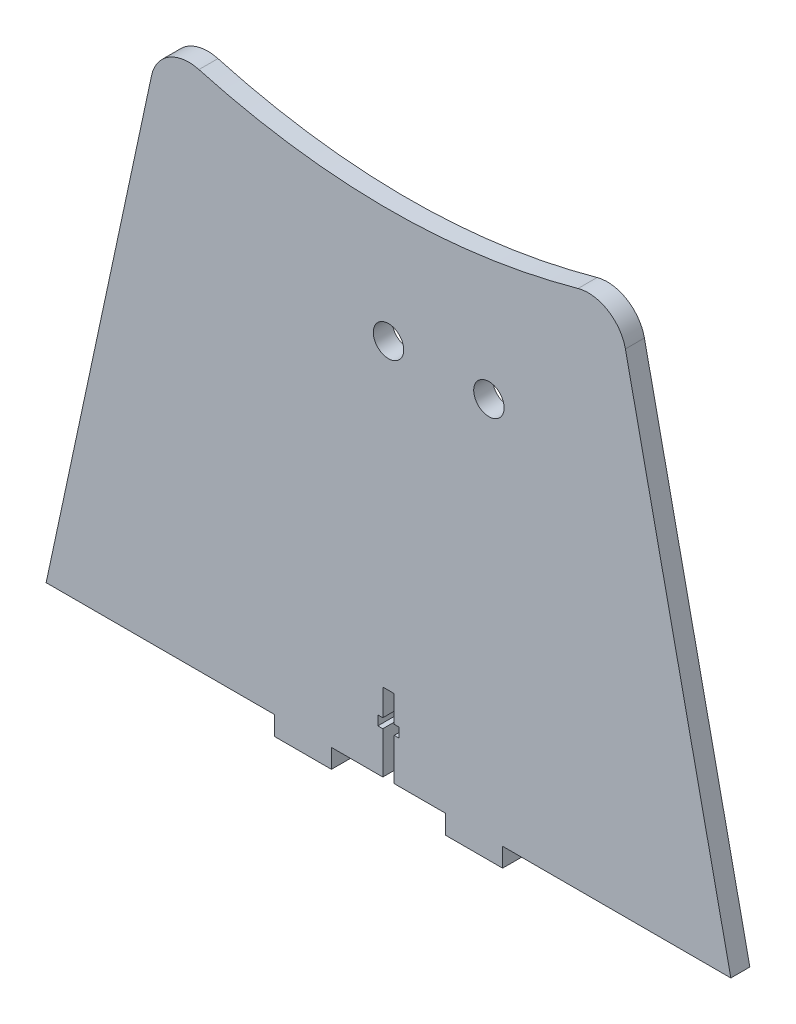
ISO-10303-21;
HEADER;
FILE_DESCRIPTION(('STEP AP214'),'2;1');
FILE_NAME('part.step','',(''),(''),'','','');
FILE_SCHEMA(('AUTOMOTIVE_DESIGN { 1 0 10303 214 1 1 1 1 }'));
ENDSEC;
DATA;
#1=APPLICATION_CONTEXT('core data for automotive mechanical design processes');
#2=APPLICATION_PROTOCOL_DEFINITION('international standard','automotive_design',2000,#1);
#3=PRODUCT_CONTEXT('',#1,'mechanical');
#4=PRODUCT('Part','Part','',(#3));
#5=PRODUCT_RELATED_PRODUCT_CATEGORY('part','',(#4));
#6=PRODUCT_DEFINITION_FORMATION('','',#4);
#7=PRODUCT_DEFINITION_CONTEXT('part definition',#1,'design');
#8=PRODUCT_DEFINITION('design','',#6,#7);
#9=PRODUCT_DEFINITION_SHAPE('','',#8);
#10=(LENGTH_UNIT() NAMED_UNIT(*) SI_UNIT(.MILLI.,.METRE.));
#11=(NAMED_UNIT(*) PLANE_ANGLE_UNIT() SI_UNIT($,.RADIAN.));
#12=(NAMED_UNIT(*) SI_UNIT($,.STERADIAN.) SOLID_ANGLE_UNIT());
#13=UNCERTAINTY_MEASURE_WITH_UNIT(LENGTH_MEASURE(1.E-05),#10,'distance_accuracy_value','');
#14=(GEOMETRIC_REPRESENTATION_CONTEXT(3) GLOBAL_UNCERTAINTY_ASSIGNED_CONTEXT((#13)) GLOBAL_UNIT_ASSIGNED_CONTEXT((#10,
#11,#12)) REPRESENTATION_CONTEXT('',''));
#15=CARTESIAN_POINT('',(0.,0.,0.));
#16=DIRECTION('',(0.,0.,1.));
#17=DIRECTION('',(1.,0.,0.));
#18=AXIS2_PLACEMENT_3D('',#15,#16,#17);
#19=CARTESIAN_POINT('',(52.545739232614,87.1208248078202,5.));
#20=DIRECTION('',(0.,0.,1.));
#21=DIRECTION('',(1.,0.,0.));
#22=AXIS2_PLACEMENT_3D('',#19,#20,#21);
#23=PLANE('',#22);
#24=CARTESIAN_POINT('',(26.4429896128564,59.8597265776105,5.));
#25=DIRECTION('',(0.,0.,1.));
#26=DIRECTION('',(1.,0.,0.));
#27=AXIS2_PLACEMENT_3D('',#24,#25,#26);
#28=CIRCLE('',#27,4.);
#29=CARTESIAN_POINT('',(30.4429896128564,59.8597265776105,5.));
#30=VERTEX_POINT('',#29);
#31=EDGE_CURVE('E244',#30,#30,#28,.T.);
#32=ORIENTED_EDGE('',*,*,#31,.F.);
#33=EDGE_LOOP('',(#32));
#34=FACE_BOUND('',#33,.T.);
#35=DIRECTION('',(1.,0.,0.));
#36=VECTOR('',#35,1.);
#37=CARTESIAN_POINT('',(-89.9570103871437,-40.1402734223895,5.));
#38=LINE('',#37,#36);
#39=CARTESIAN_POINT('',(-89.9570103871437,-40.1402734223895,5.));
#40=VERTEX_POINT('',#39);
#41=CARTESIAN_POINT('',(-29.9570103871437,-40.1402734223895,5.));
#42=VERTEX_POINT('',#41);
#43=EDGE_CURVE('E296',#40,#42,#38,.T.);
#44=ORIENTED_EDGE('',*,*,#43,.T.);
#45=DIRECTION('',(0.,-1.,0.));
#46=VECTOR('',#45,1.);
#47=CARTESIAN_POINT('',(-29.9570103871437,-40.1402734223895,5.));
#48=LINE('',#47,#46);
#49=CARTESIAN_POINT('',(-29.9570103871437,-45.1402734223895,5.));
#50=VERTEX_POINT('',#49);
#51=EDGE_CURVE('E146',#42,#50,#48,.T.);
#52=ORIENTED_EDGE('',*,*,#51,.T.);
#53=DIRECTION('',(1.,0.,0.));
#54=VECTOR('',#53,1.);
#55=CARTESIAN_POINT('',(-29.9570103871437,-45.1402734223895,5.));
#56=LINE('',#55,#54);
#57=CARTESIAN_POINT('',(-14.9570103871437,-45.1402734223895,5.));
#58=VERTEX_POINT('',#57);
#59=EDGE_CURVE('E365',#50,#58,#56,.T.);
#60=ORIENTED_EDGE('',*,*,#59,.T.);
#61=DIRECTION('',(0.,1.,0.));
#62=VECTOR('',#61,1.);
#63=CARTESIAN_POINT('',(-14.9570103871437,-45.1402734223895,5.));
#64=LINE('',#63,#62);
#65=CARTESIAN_POINT('',(-14.9570103871437,-40.1402734223895,5.));
#66=VERTEX_POINT('',#65);
#67=EDGE_CURVE('E384',#58,#66,#64,.T.);
#68=ORIENTED_EDGE('',*,*,#67,.T.);
#69=DIRECTION('',(1.,0.,0.));
#70=VECTOR('',#69,1.);
#71=CARTESIAN_POINT('',(-1.45701038714302,-40.1402734223895,5.));
#72=LINE('',#71,#70);
#73=CARTESIAN_POINT('',(-1.45701038714302,-40.1402734223895,5.));
#74=VERTEX_POINT('',#73);
#75=EDGE_CURVE('E381',#66,#74,#72,.T.);
#76=ORIENTED_EDGE('',*,*,#75,.T.);
#77=DIRECTION('',(0.,1.,0.));
#78=VECTOR('',#77,1.);
#79=CARTESIAN_POINT('',(-1.45701038714302,-40.1402734223895,5.));
#80=LINE('',#79,#78);
#81=CARTESIAN_POINT('',(-1.45701038714302,-29.1402734223895,5.));
#82=VERTEX_POINT('',#81);
#83=EDGE_CURVE('E383',#74,#82,#80,.T.);
#84=ORIENTED_EDGE('',*,*,#83,.T.);
#85=DIRECTION('',(-1.,0.,0.));
#86=VECTOR('',#85,1.);
#87=CARTESIAN_POINT('',(-1.45701038714302,-29.1402734223895,5.));
#88=LINE('',#87,#86);
#89=CARTESIAN_POINT('',(-2.75701038714444,-29.1402734223895,5.));
#90=VERTEX_POINT('',#89);
#91=EDGE_CURVE('E386',#82,#90,#88,.T.);
#92=ORIENTED_EDGE('',*,*,#91,.T.);
#93=DIRECTION('',(0.,1.,0.));
#94=VECTOR('',#93,1.);
#95=CARTESIAN_POINT('',(-2.75701038714444,-26.6402734223901,5.));
#96=LINE('',#95,#94);
#97=CARTESIAN_POINT('',(-2.75701038714444,-26.6402734223901,5.));
#98=VERTEX_POINT('',#97);
#99=EDGE_CURVE('E392',#90,#98,#96,.T.);
#100=ORIENTED_EDGE('',*,*,#99,.T.);
#101=DIRECTION('',(1.,0.,0.));
#102=VECTOR('',#101,1.);
#103=CARTESIAN_POINT('',(-1.45701038714456,-26.6402734223901,5.));
#104=LINE('',#103,#102);
#105=CARTESIAN_POINT('',(-1.45701038714456,-26.6402734223901,5.));
#106=VERTEX_POINT('',#105);
#107=EDGE_CURVE('E394',#98,#106,#104,.T.);
#108=ORIENTED_EDGE('',*,*,#107,.T.);
#109=DIRECTION('',(0.,1.,0.));
#110=VECTOR('',#109,1.);
#111=CARTESIAN_POINT('',(-1.45701038714456,-19.6402734223901,5.));
#112=LINE('',#111,#110);
#113=CARTESIAN_POINT('',(-1.45701038714456,-19.6402734223901,5.));
#114=VERTEX_POINT('',#113);
#115=EDGE_CURVE('E396',#106,#114,#112,.T.);
#116=ORIENTED_EDGE('',*,*,#115,.T.);
#117=DIRECTION('',(1.,0.,0.));
#118=VECTOR('',#117,1.);
#119=CARTESIAN_POINT('',(-1.45701038714456,-19.6402734223901,5.));
#120=LINE('',#119,#118);
#121=CARTESIAN_POINT('',(1.54298961285559,-19.6402734223901,5.));
#122=VERTEX_POINT('',#121);
#123=EDGE_CURVE('E398',#114,#122,#120,.T.);
#124=ORIENTED_EDGE('',*,*,#123,.T.);
#125=DIRECTION('',(0.,-1.,0.));
#126=VECTOR('',#125,1.);
#127=CARTESIAN_POINT('',(1.54298961285559,-26.6402734223901,5.));
#128=LINE('',#127,#126);
#129=CARTESIAN_POINT('',(1.54298961285559,-26.6402734223901,5.));
#130=VERTEX_POINT('',#129);
#131=EDGE_CURVE('E400',#122,#130,#128,.T.);
#132=ORIENTED_EDGE('',*,*,#131,.T.);
#133=DIRECTION('',(1.,0.,0.));
#134=VECTOR('',#133,1.);
#135=CARTESIAN_POINT('',(2.84298961285561,-26.6402734223901,5.));
#136=LINE('',#135,#134);
#137=CARTESIAN_POINT('',(2.84298961285561,-26.6402734223901,5.));
#138=VERTEX_POINT('',#137);
#139=EDGE_CURVE('E402',#130,#138,#136,.T.);
#140=ORIENTED_EDGE('',*,*,#139,.T.);
#141=DIRECTION('',(0.,-1.,0.));
#142=VECTOR('',#141,1.);
#143=CARTESIAN_POINT('',(2.84298961285561,-29.1402734223895,5.));
#144=LINE('',#143,#142);
#145=CARTESIAN_POINT('',(2.84298961285561,-29.1402734223895,5.));
#146=VERTEX_POINT('',#145);
#147=EDGE_CURVE('E404',#138,#146,#144,.T.);
#148=ORIENTED_EDGE('',*,*,#147,.T.);
#149=DIRECTION('',(-1.,0.,0.));
#150=VECTOR('',#149,1.);
#151=CARTESIAN_POINT('',(1.54298961285565,-29.1402734223895,5.));
#152=LINE('',#151,#150);
#153=CARTESIAN_POINT('',(1.54298961285565,-29.1402734223895,5.));
#154=VERTEX_POINT('',#153);
#155=EDGE_CURVE('E406',#146,#154,#152,.T.);
#156=ORIENTED_EDGE('',*,*,#155,.T.);
#157=DIRECTION('',(0.,-1.,0.));
#158=VECTOR('',#157,1.);
#159=CARTESIAN_POINT('',(1.54298961285565,-40.1402734223895,5.));
#160=LINE('',#159,#158);
#161=CARTESIAN_POINT('',(1.54298961285565,-40.1402734223895,5.));
#162=VERTEX_POINT('',#161);
#163=EDGE_CURVE('E408',#154,#162,#160,.T.);
#164=ORIENTED_EDGE('',*,*,#163,.T.);
#165=DIRECTION('',(1.,0.,0.));
#166=VECTOR('',#165,1.);
#167=CARTESIAN_POINT('',(15.0429896128563,-40.1402734223895,5.));
#168=LINE('',#167,#166);
#169=CARTESIAN_POINT('',(15.0429896128563,-40.1402734223895,5.));
#170=VERTEX_POINT('',#169);
#171=EDGE_CURVE('E410',#162,#170,#168,.T.);
#172=ORIENTED_EDGE('',*,*,#171,.T.);
#173=DIRECTION('',(0.,-1.,0.));
#174=VECTOR('',#173,1.);
#175=CARTESIAN_POINT('',(15.0429896128563,-40.1402734223895,5.));
#176=LINE('',#175,#174);
#177=CARTESIAN_POINT('',(15.0429896128563,-45.1402734223895,5.));
#178=VERTEX_POINT('',#177);
#179=EDGE_CURVE('E412',#170,#178,#176,.T.);
#180=ORIENTED_EDGE('',*,*,#179,.T.);
#181=DIRECTION('',(1.,0.,0.));
#182=VECTOR('',#181,1.);
#183=CARTESIAN_POINT('',(15.0429896128563,-45.1402734223895,5.));
#184=LINE('',#183,#182);
#185=CARTESIAN_POINT('',(30.0429896128563,-45.1402734223895,5.));
#186=VERTEX_POINT('',#185);
#187=EDGE_CURVE('E414',#178,#186,#184,.T.);
#188=ORIENTED_EDGE('',*,*,#187,.T.);
#189=DIRECTION('',(0.,1.,0.));
#190=VECTOR('',#189,1.);
#191=CARTESIAN_POINT('',(30.0429896128563,-45.1402734223895,5.));
#192=LINE('',#191,#190);
#193=CARTESIAN_POINT('',(30.0429896128563,-40.1402734223895,5.));
#194=VERTEX_POINT('',#193);
#195=EDGE_CURVE('E416',#186,#194,#192,.T.);
#196=ORIENTED_EDGE('',*,*,#195,.T.);
#197=DIRECTION('',(1.,0.,0.));
#198=VECTOR('',#197,1.);
#199=CARTESIAN_POINT('',(30.0429896128563,-40.1402734223895,5.));
#200=LINE('',#199,#198);
#201=CARTESIAN_POINT('',(90.0429896128563,-40.1402734223895,5.));
#202=VERTEX_POINT('',#201);
#203=EDGE_CURVE('E418',#194,#202,#200,.T.);
#204=ORIENTED_EDGE('',*,*,#203,.T.);
#205=DIRECTION('',(-0.209529088730873,0.977802414077409,0.));
#206=VECTOR('',#205,1.);
#207=CARTESIAN_POINT('',(90.0429896128563,-40.1402734223895,5.));
#208=LINE('',#207,#206);
#209=CARTESIAN_POINT('',(62.3237633733881,89.2161156951289,5.));
#210=VERTEX_POINT('',#209);
#211=EDGE_CURVE('E420',#202,#210,#208,.T.);
#212=ORIENTED_EDGE('',*,*,#211,.T.);
#213=CARTESIAN_POINT('',(52.545739232614,87.1208248078202,5.));
#214=DIRECTION('',(0.,0.,1.));
#215=DIRECTION('',(1.,0.,0.));
#216=AXIS2_PLACEMENT_3D('',#213,#214,#215);
#217=CIRCLE('',#216,10.);
#218=CARTESIAN_POINT('',(49.8775261147264,96.7582849897111,5.));
#219=VERTEX_POINT('',#218);
#220=EDGE_CURVE('E219',#210,#219,#217,.T.);
#221=ORIENTED_EDGE('',*,*,#220,.T.);
#222=CARTESIAN_POINT('',(49.8775261147264,96.7582849897111,5.));
#223=CARTESIAN_POINT('',(33.2660139474307,92.1592460483091,5.));
#224=CARTESIAN_POINT('',(0.0429896128563211,87.5602071069119,5.));
#225=CARTESIAN_POINT('',(-33.180034721718,92.1592460483091,5.));
#226=CARTESIAN_POINT('',(-49.7915468890138,96.7582849897111,5.));
#227=B_SPLINE_CURVE_WITH_KNOTS('',3,(#222,#223,#224,#225,#226),.UNSPECIFIED.,.F.,.F.,(4,1,4),
(0.0847121958176033,0.499999999999987,0.915287804182371),.UNSPECIFIED.);
#228=CARTESIAN_POINT('',(-49.7915468890138,96.7582849897111,5.));
#229=VERTEX_POINT('',#228);
#230=EDGE_CURVE('E213',#219,#229,#227,.T.);
#231=ORIENTED_EDGE('',*,*,#230,.T.);
#232=CARTESIAN_POINT('',(-52.4597600069014,87.1208248078202,5.));
#233=DIRECTION('',(0.,0.,1.));
#234=DIRECTION('',(-1.,0.,0.));
#235=AXIS2_PLACEMENT_3D('',#232,#233,#234);
#236=CIRCLE('',#235,9.99999999999999);
#237=CARTESIAN_POINT('',(-62.2377841476755,89.2161156951289,5.));
#238=VERTEX_POINT('',#237);
#239=EDGE_CURVE('E217',#229,#238,#236,.T.);
#240=ORIENTED_EDGE('',*,*,#239,.T.);
#241=DIRECTION('',(-0.209529088730873,-0.977802414077409,0.));
#242=VECTOR('',#241,1.);
#243=CARTESIAN_POINT('',(-89.9570103871437,-40.1402734223895,5.));
#244=LINE('',#243,#242);
#245=EDGE_CURVE('E49',#238,#40,#244,.T.);
#246=ORIENTED_EDGE('',*,*,#245,.T.);
#247=EDGE_LOOP('',(#44,#52,#60,#68,#76,#84,#92,#100,#108,#116,#124,#132,#140,#148,#156,#164,
#172,#180,#188,#196,#204,#212,#221,#231,#240,#246));
#248=FACE_BOUND('',#247,.T.);
#249=CARTESIAN_POINT('',(0.0429896128563492,59.8597265776105,5.));
#250=DIRECTION('',(0.,0.,1.));
#251=DIRECTION('',(1.,0.,0.));
#252=AXIS2_PLACEMENT_3D('',#249,#250,#251);
#253=CIRCLE('',#252,4.);
#254=CARTESIAN_POINT('',(4.04298961285635,59.8597265776105,5.));
#255=VERTEX_POINT('',#254);
#256=EDGE_CURVE('E463',#255,#255,#253,.T.);
#257=ORIENTED_EDGE('',*,*,#256,.F.);
#258=EDGE_LOOP('',(#257));
#259=FACE_BOUND('',#258,.T.);
#260=ADVANCED_FACE('F32',(#34,#248,#259),#23,.T.);
#261=CARTESIAN_POINT('',(52.545739232614,87.1208248078202,0.));
#262=DIRECTION('',(0.,0.,1.));
#263=DIRECTION('',(1.,0.,0.));
#264=AXIS2_PLACEMENT_3D('',#261,#262,#263);
#265=PLANE('',#264);
#266=CARTESIAN_POINT('',(26.4429896128564,59.8597265776105,0.));
#267=DIRECTION('',(0.,0.,1.));
#268=DIRECTION('',(1.,0.,0.));
#269=AXIS2_PLACEMENT_3D('',#266,#267,#268);
#270=CIRCLE('',#269,4.);
#271=CARTESIAN_POINT('',(30.4429896128564,59.8597265776105,0.));
#272=VERTEX_POINT('',#271);
#273=EDGE_CURVE('E468',#272,#272,#270,.T.);
#274=ORIENTED_EDGE('',*,*,#273,.T.);
#275=EDGE_LOOP('',(#274));
#276=FACE_BOUND('',#275,.T.);
#277=DIRECTION('',(1.,0.,0.));
#278=VECTOR('',#277,1.);
#279=CARTESIAN_POINT('',(-89.9570103871437,-40.1402734223895,0.));
#280=LINE('',#279,#278);
#281=CARTESIAN_POINT('',(-89.9570103871437,-40.1402734223895,0.));
#282=VERTEX_POINT('',#281);
#283=CARTESIAN_POINT('',(-29.9570103871437,-40.1402734223895,0.));
#284=VERTEX_POINT('',#283);
#285=EDGE_CURVE('E240',#282,#284,#280,.T.);
#286=ORIENTED_EDGE('',*,*,#285,.F.);
#287=DIRECTION('',(-0.209529088730873,-0.977802414077409,0.));
#288=VECTOR('',#287,1.);
#289=CARTESIAN_POINT('',(-89.9570103871437,-40.1402734223895,0.));
#290=LINE('',#289,#288);
#291=CARTESIAN_POINT('',(-62.2377841476755,89.2161156951289,0.));
#292=VERTEX_POINT('',#291);
#293=EDGE_CURVE('E138',#292,#282,#290,.T.);
#294=ORIENTED_EDGE('',*,*,#293,.F.);
#295=CARTESIAN_POINT('',(-52.4597600069014,87.1208248078202,0.));
#296=DIRECTION('',(0.,0.,1.));
#297=DIRECTION('',(-1.,0.,0.));
#298=AXIS2_PLACEMENT_3D('',#295,#296,#297);
#299=CIRCLE('',#298,9.99999999999999);
#300=CARTESIAN_POINT('',(-49.7915468890138,96.7582849897111,0.));
#301=VERTEX_POINT('',#300);
#302=EDGE_CURVE('E132',#301,#292,#299,.T.);
#303=ORIENTED_EDGE('',*,*,#302,.F.);
#304=CARTESIAN_POINT('',(49.8775261147264,96.7582849897111,0.));
#305=CARTESIAN_POINT('',(33.2660139474307,92.1592460483091,0.));
#306=CARTESIAN_POINT('',(0.0429896128563211,87.5602071069119,0.));
#307=CARTESIAN_POINT('',(-33.180034721718,92.1592460483091,0.));
#308=CARTESIAN_POINT('',(-49.7915468890138,96.7582849897111,0.));
#309=B_SPLINE_CURVE_WITH_KNOTS('',3,(#304,#305,#306,#307,#308),.UNSPECIFIED.,.F.,.F.,(4,1,4),
(0.0847121958176033,0.499999999999987,0.915287804182371),.UNSPECIFIED.);
#310=CARTESIAN_POINT('',(49.8775261147264,96.7582849897111,0.));
#311=VERTEX_POINT('',#310);
#312=EDGE_CURVE('E227',#311,#301,#309,.T.);
#313=ORIENTED_EDGE('',*,*,#312,.F.);
#314=CARTESIAN_POINT('',(52.545739232614,87.1208248078202,0.));
#315=DIRECTION('',(0.,0.,1.));
#316=DIRECTION('',(1.,0.,0.));
#317=AXIS2_PLACEMENT_3D('',#314,#315,#316);
#318=CIRCLE('',#317,10.);
#319=CARTESIAN_POINT('',(62.3237633733881,89.2161156951289,0.));
#320=VERTEX_POINT('',#319);
#321=EDGE_CURVE('E286',#320,#311,#318,.T.);
#322=ORIENTED_EDGE('',*,*,#321,.F.);
#323=DIRECTION('',(-0.209529088730873,0.977802414077409,0.));
#324=VECTOR('',#323,1.);
#325=CARTESIAN_POINT('',(90.0429896128563,-40.1402734223895,0.));
#326=LINE('',#325,#324);
#327=CARTESIAN_POINT('',(90.0429896128563,-40.1402734223895,0.));
#328=VERTEX_POINT('',#327);
#329=EDGE_CURVE('E284',#328,#320,#326,.T.);
#330=ORIENTED_EDGE('',*,*,#329,.F.);
#331=DIRECTION('',(1.,0.,0.));
#332=VECTOR('',#331,1.);
#333=CARTESIAN_POINT('',(30.0429896128563,-40.1402734223895,0.));
#334=LINE('',#333,#332);
#335=CARTESIAN_POINT('',(30.0429896128563,-40.1402734223895,0.));
#336=VERTEX_POINT('',#335);
#337=EDGE_CURVE('E282',#336,#328,#334,.T.);
#338=ORIENTED_EDGE('',*,*,#337,.F.);
#339=DIRECTION('',(0.,1.,0.));
#340=VECTOR('',#339,1.);
#341=CARTESIAN_POINT('',(30.0429896128563,-45.1402734223895,0.));
#342=LINE('',#341,#340);
#343=CARTESIAN_POINT('',(30.0429896128563,-45.1402734223895,0.));
#344=VERTEX_POINT('',#343);
#345=EDGE_CURVE('E280',#344,#336,#342,.T.);
#346=ORIENTED_EDGE('',*,*,#345,.F.);
#347=DIRECTION('',(1.,0.,0.));
#348=VECTOR('',#347,1.);
#349=CARTESIAN_POINT('',(15.0429896128563,-45.1402734223895,0.));
#350=LINE('',#349,#348);
#351=CARTESIAN_POINT('',(15.0429896128563,-45.1402734223895,0.));
#352=VERTEX_POINT('',#351);
#353=EDGE_CURVE('E278',#352,#344,#350,.T.);
#354=ORIENTED_EDGE('',*,*,#353,.F.);
#355=DIRECTION('',(0.,-1.,0.));
#356=VECTOR('',#355,1.);
#357=CARTESIAN_POINT('',(15.0429896128563,-40.1402734223895,0.));
#358=LINE('',#357,#356);
#359=CARTESIAN_POINT('',(15.0429896128563,-40.1402734223895,0.));
#360=VERTEX_POINT('',#359);
#361=EDGE_CURVE('E276',#360,#352,#358,.T.);
#362=ORIENTED_EDGE('',*,*,#361,.F.);
#363=DIRECTION('',(1.,0.,0.));
#364=VECTOR('',#363,1.);
#365=CARTESIAN_POINT('',(15.0429896128563,-40.1402734223895,0.));
#366=LINE('',#365,#364);
#367=CARTESIAN_POINT('',(1.54298961285565,-40.1402734223895,0.));
#368=VERTEX_POINT('',#367);
#369=EDGE_CURVE('E274',#368,#360,#366,.T.);
#370=ORIENTED_EDGE('',*,*,#369,.F.);
#371=DIRECTION('',(0.,-1.,0.));
#372=VECTOR('',#371,1.);
#373=CARTESIAN_POINT('',(1.54298961285565,-40.1402734223895,0.));
#374=LINE('',#373,#372);
#375=CARTESIAN_POINT('',(1.54298961285565,-29.1402734223895,0.));
#376=VERTEX_POINT('',#375);
#377=EDGE_CURVE('E272',#376,#368,#374,.T.);
#378=ORIENTED_EDGE('',*,*,#377,.F.);
#379=DIRECTION('',(-1.,0.,0.));
#380=VECTOR('',#379,1.);
#381=CARTESIAN_POINT('',(1.54298961285565,-29.1402734223895,0.));
#382=LINE('',#381,#380);
#383=CARTESIAN_POINT('',(2.84298961285561,-29.1402734223895,0.));
#384=VERTEX_POINT('',#383);
#385=EDGE_CURVE('E270',#384,#376,#382,.T.);
#386=ORIENTED_EDGE('',*,*,#385,.F.);
#387=DIRECTION('',(0.,-1.,0.));
#388=VECTOR('',#387,1.);
#389=CARTESIAN_POINT('',(2.84298961285561,-29.1402734223895,0.));
#390=LINE('',#389,#388);
#391=CARTESIAN_POINT('',(2.84298961285561,-26.6402734223901,0.));
#392=VERTEX_POINT('',#391);
#393=EDGE_CURVE('E268',#392,#384,#390,.T.);
#394=ORIENTED_EDGE('',*,*,#393,.F.);
#395=DIRECTION('',(1.,0.,0.));
#396=VECTOR('',#395,1.);
#397=CARTESIAN_POINT('',(2.84298961285561,-26.6402734223901,0.));
#398=LINE('',#397,#396);
#399=CARTESIAN_POINT('',(1.54298961285559,-26.6402734223901,0.));
#400=VERTEX_POINT('',#399);
#401=EDGE_CURVE('E266',#400,#392,#398,.T.);
#402=ORIENTED_EDGE('',*,*,#401,.F.);
#403=DIRECTION('',(0.,-1.,0.));
#404=VECTOR('',#403,1.);
#405=CARTESIAN_POINT('',(1.54298961285559,-26.6402734223901,0.));
#406=LINE('',#405,#404);
#407=CARTESIAN_POINT('',(1.54298961285559,-19.6402734223901,0.));
#408=VERTEX_POINT('',#407);
#409=EDGE_CURVE('E264',#408,#400,#406,.T.);
#410=ORIENTED_EDGE('',*,*,#409,.F.);
#411=DIRECTION('',(1.,0.,0.));
#412=VECTOR('',#411,1.);
#413=CARTESIAN_POINT('',(-1.45701038714456,-19.6402734223901,0.));
#414=LINE('',#413,#412);
#415=CARTESIAN_POINT('',(-1.45701038714456,-19.6402734223901,0.));
#416=VERTEX_POINT('',#415);
#417=EDGE_CURVE('E262',#416,#408,#414,.T.);
#418=ORIENTED_EDGE('',*,*,#417,.F.);
#419=DIRECTION('',(0.,1.,0.));
#420=VECTOR('',#419,1.);
#421=CARTESIAN_POINT('',(-1.45701038714456,-19.6402734223901,0.));
#422=LINE('',#421,#420);
#423=CARTESIAN_POINT('',(-1.45701038714456,-26.6402734223901,0.));
#424=VERTEX_POINT('',#423);
#425=EDGE_CURVE('E260',#424,#416,#422,.T.);
#426=ORIENTED_EDGE('',*,*,#425,.F.);
#427=DIRECTION('',(1.,0.,0.));
#428=VECTOR('',#427,1.);
#429=CARTESIAN_POINT('',(-1.45701038714456,-26.6402734223901,0.));
#430=LINE('',#429,#428);
#431=CARTESIAN_POINT('',(-2.75701038714444,-26.6402734223901,0.));
#432=VERTEX_POINT('',#431);
#433=EDGE_CURVE('E258',#432,#424,#430,.T.);
#434=ORIENTED_EDGE('',*,*,#433,.F.);
#435=DIRECTION('',(0.,1.,0.));
#436=VECTOR('',#435,1.);
#437=CARTESIAN_POINT('',(-2.75701038714444,-26.6402734223901,0.));
#438=LINE('',#437,#436);
#439=CARTESIAN_POINT('',(-2.75701038714444,-29.1402734223895,0.));
#440=VERTEX_POINT('',#439);
#441=EDGE_CURVE('E256',#440,#432,#438,.T.);
#442=ORIENTED_EDGE('',*,*,#441,.F.);
#443=DIRECTION('',(-1.,0.,0.));
#444=VECTOR('',#443,1.);
#445=CARTESIAN_POINT('',(-1.45701038714302,-29.1402734223895,0.));
#446=LINE('',#445,#444);
#447=CARTESIAN_POINT('',(-1.45701038714302,-29.1402734223895,0.));
#448=VERTEX_POINT('',#447);
#449=EDGE_CURVE('E254',#448,#440,#446,.T.);
#450=ORIENTED_EDGE('',*,*,#449,.F.);
#451=DIRECTION('',(0.,1.,0.));
#452=VECTOR('',#451,1.);
#453=CARTESIAN_POINT('',(-1.45701038714302,-40.1402734223895,0.));
#454=LINE('',#453,#452);
#455=CARTESIAN_POINT('',(-1.45701038714302,-40.1402734223895,0.));
#456=VERTEX_POINT('',#455);
#457=EDGE_CURVE('E252',#456,#448,#454,.T.);
#458=ORIENTED_EDGE('',*,*,#457,.F.);
#459=DIRECTION('',(1.,0.,0.));
#460=VECTOR('',#459,1.);
#461=CARTESIAN_POINT('',(-1.45701038714302,-40.1402734223895,0.));
#462=LINE('',#461,#460);
#463=CARTESIAN_POINT('',(-14.9570103871437,-40.1402734223895,0.));
#464=VERTEX_POINT('',#463);
#465=EDGE_CURVE('E250',#464,#456,#462,.T.);
#466=ORIENTED_EDGE('',*,*,#465,.F.);
#467=DIRECTION('',(0.,1.,0.));
#468=VECTOR('',#467,1.);
#469=CARTESIAN_POINT('',(-14.9570103871437,-45.1402734223895,0.));
#470=LINE('',#469,#468);
#471=CARTESIAN_POINT('',(-14.9570103871437,-45.1402734223895,0.));
#472=VERTEX_POINT('',#471);
#473=EDGE_CURVE('E248',#472,#464,#470,.T.);
#474=ORIENTED_EDGE('',*,*,#473,.F.);
#475=DIRECTION('',(1.,0.,0.));
#476=VECTOR('',#475,1.);
#477=CARTESIAN_POINT('',(-29.9570103871437,-45.1402734223895,0.));
#478=LINE('',#477,#476);
#479=CARTESIAN_POINT('',(-29.9570103871437,-45.1402734223895,0.));
#480=VERTEX_POINT('',#479);
#481=EDGE_CURVE('E246',#480,#472,#478,.T.);
#482=ORIENTED_EDGE('',*,*,#481,.F.);
#483=DIRECTION('',(0.,-1.,0.));
#484=VECTOR('',#483,1.);
#485=CARTESIAN_POINT('',(-29.9570103871437,-40.1402734223895,0.));
#486=LINE('',#485,#484);
#487=EDGE_CURVE('E243',#284,#480,#486,.T.);
#488=ORIENTED_EDGE('',*,*,#487,.F.);
#489=EDGE_LOOP('',(#286,#294,#303,#313,#322,#330,#338,#346,#354,#362,#370,#378,#386,#394,#402,
#410,#418,#426,#434,#442,#450,#458,#466,#474,#482,#488));
#490=FACE_BOUND('',#489,.T.);
#491=CARTESIAN_POINT('',(0.0429896128563492,59.8597265776105,0.));
#492=DIRECTION('',(0.,0.,1.));
#493=DIRECTION('',(1.,0.,0.));
#494=AXIS2_PLACEMENT_3D('',#491,#492,#493);
#495=CIRCLE('',#494,4.);
#496=CARTESIAN_POINT('',(4.04298961285635,59.8597265776105,0.));
#497=VERTEX_POINT('',#496);
#498=EDGE_CURVE('E466',#497,#497,#495,.T.);
#499=ORIENTED_EDGE('',*,*,#498,.T.);
#500=EDGE_LOOP('',(#499));
#501=FACE_BOUND('',#500,.T.);
#502=ADVANCED_FACE('F369',(#276,#490,#501),#265,.F.);
#503=CARTESIAN_POINT('',(-89.9570103871437,-40.1402734223895,5.));
#504=DIRECTION('',(0.,1.,0.));
#505=DIRECTION('',(0.,0.,1.));
#506=AXIS2_PLACEMENT_3D('',#503,#504,#505);
#507=PLANE('',#506);
#508=ORIENTED_EDGE('',*,*,#285,.T.);
#509=DIRECTION('',(0.,0.,-1.));
#510=VECTOR('',#509,1.);
#511=CARTESIAN_POINT('',(-29.9570103871437,-40.1402734223895,5.));
#512=LINE('',#511,#510);
#513=EDGE_CURVE('E11',#42,#284,#512,.T.);
#514=ORIENTED_EDGE('',*,*,#513,.F.);
#515=ORIENTED_EDGE('',*,*,#43,.F.);
#516=DIRECTION('',(0.,0.,-1.));
#517=VECTOR('',#516,1.);
#518=CARTESIAN_POINT('',(-89.9570103871437,-40.1402734223895,5.));
#519=LINE('',#518,#517);
#520=EDGE_CURVE('E233',#40,#282,#519,.T.);
#521=ORIENTED_EDGE('',*,*,#520,.T.);
#522=EDGE_LOOP('',(#508,#514,#515,#521));
#523=FACE_BOUND('',#522,.T.);
#524=ADVANCED_FACE('F34',(#523),#507,.F.);
#525=CARTESIAN_POINT('',(-29.9570103871437,-40.1402734223895,5.));
#526=DIRECTION('',(1.,0.,0.));
#527=DIRECTION('',(0.,1.,0.));
#528=AXIS2_PLACEMENT_3D('',#525,#526,#527);
#529=PLANE('',#528);
#530=ORIENTED_EDGE('',*,*,#487,.T.);
#531=DIRECTION('',(0.,0.,-1.));
#532=VECTOR('',#531,1.);
#533=CARTESIAN_POINT('',(-29.9570103871437,-45.1402734223895,5.));
#534=LINE('',#533,#532);
#535=EDGE_CURVE('E41',#50,#480,#534,.T.);
#536=ORIENTED_EDGE('',*,*,#535,.F.);
#537=ORIENTED_EDGE('',*,*,#51,.F.);
#538=ORIENTED_EDGE('',*,*,#513,.T.);
#539=EDGE_LOOP('',(#530,#536,#537,#538));
#540=FACE_BOUND('',#539,.T.);
#541=ADVANCED_FACE('F701',(#540),#529,.F.);
#542=CARTESIAN_POINT('',(-29.9570103871437,-45.1402734223895,5.));
#543=DIRECTION('',(0.,1.,0.));
#544=DIRECTION('',(0.,0.,1.));
#545=AXIS2_PLACEMENT_3D('',#542,#543,#544);
#546=PLANE('',#545);
#547=ORIENTED_EDGE('',*,*,#481,.T.);
#548=DIRECTION('',(0.,0.,-1.));
#549=VECTOR('',#548,1.);
#550=CARTESIAN_POINT('',(-14.9570103871437,-45.1402734223895,5.));
#551=LINE('',#550,#549);
#552=EDGE_CURVE('E357',#58,#472,#551,.T.);
#553=ORIENTED_EDGE('',*,*,#552,.F.);
#554=ORIENTED_EDGE('',*,*,#59,.F.);
#555=ORIENTED_EDGE('',*,*,#535,.T.);
#556=EDGE_LOOP('',(#547,#553,#554,#555));
#557=FACE_BOUND('',#556,.T.);
#558=ADVANCED_FACE('F363',(#557),#546,.F.);
#559=CARTESIAN_POINT('',(-14.9570103871437,-45.1402734223895,5.));
#560=DIRECTION('',(-1.,0.,0.));
#561=DIRECTION('',(0.,0.,1.));
#562=AXIS2_PLACEMENT_3D('',#559,#560,#561);
#563=PLANE('',#562);
#564=ORIENTED_EDGE('',*,*,#473,.T.);
#565=DIRECTION('',(0.,0.,-1.));
#566=VECTOR('',#565,1.);
#567=CARTESIAN_POINT('',(-14.9570103871437,-40.1402734223895,5.));
#568=LINE('',#567,#566);
#569=EDGE_CURVE('E354',#66,#464,#568,.T.);
#570=ORIENTED_EDGE('',*,*,#569,.F.);
#571=ORIENTED_EDGE('',*,*,#67,.F.);
#572=ORIENTED_EDGE('',*,*,#552,.T.);
#573=EDGE_LOOP('',(#564,#570,#571,#572));
#574=FACE_BOUND('',#573,.T.);
#575=ADVANCED_FACE('F375',(#574),#563,.F.);
#576=CARTESIAN_POINT('',(-1.45701038714302,-40.1402734223895,5.));
#577=DIRECTION('',(0.,1.,0.));
#578=DIRECTION('',(-1.,0.,0.));
#579=AXIS2_PLACEMENT_3D('',#576,#577,#578);
#580=PLANE('',#579);
#581=ORIENTED_EDGE('',*,*,#465,.T.);
#582=DIRECTION('',(0.,0.,-1.));
#583=VECTOR('',#582,1.);
#584=CARTESIAN_POINT('',(-1.45701038714302,-40.1402734223895,5.));
#585=LINE('',#584,#583);
#586=EDGE_CURVE('E351',#74,#456,#585,.T.);
#587=ORIENTED_EDGE('',*,*,#586,.F.);
#588=ORIENTED_EDGE('',*,*,#75,.F.);
#589=ORIENTED_EDGE('',*,*,#569,.T.);
#590=EDGE_LOOP('',(#581,#587,#588,#589));
#591=FACE_BOUND('',#590,.T.);
#592=ADVANCED_FACE('F379',(#591),#580,.F.);
#593=CARTESIAN_POINT('',(-1.45701038714302,-40.1402734223895,5.));
#594=DIRECTION('',(-1.,0.,0.));
#595=DIRECTION('',(0.,0.,1.));
#596=AXIS2_PLACEMENT_3D('',#593,#594,#595);
#597=PLANE('',#596);
#598=ORIENTED_EDGE('',*,*,#457,.T.);
#599=DIRECTION('',(0.,0.,-1.));
#600=VECTOR('',#599,1.);
#601=CARTESIAN_POINT('',(-1.45701038714302,-29.1402734223895,5.));
#602=LINE('',#601,#600);
#603=EDGE_CURVE('E348',#82,#448,#602,.T.);
#604=ORIENTED_EDGE('',*,*,#603,.F.);
#605=ORIENTED_EDGE('',*,*,#83,.F.);
#606=ORIENTED_EDGE('',*,*,#586,.T.);
#607=EDGE_LOOP('',(#598,#604,#605,#606));
#608=FACE_BOUND('',#607,.T.);
#609=ADVANCED_FACE('F666',(#608),#597,.F.);
#610=CARTESIAN_POINT('',(-1.45701038714302,-29.1402734223895,5.));
#611=DIRECTION('',(0.,-1.,0.));
#612=DIRECTION('',(0.,0.,-1.));
#613=AXIS2_PLACEMENT_3D('',#610,#611,#612);
#614=PLANE('',#613);
#615=ORIENTED_EDGE('',*,*,#449,.T.);
#616=DIRECTION('',(0.,0.,-1.));
#617=VECTOR('',#616,1.);
#618=CARTESIAN_POINT('',(-2.75701038714444,-29.1402734223895,5.));
#619=LINE('',#618,#617);
#620=EDGE_CURVE('E345',#90,#440,#619,.T.);
#621=ORIENTED_EDGE('',*,*,#620,.F.);
#622=ORIENTED_EDGE('',*,*,#91,.F.);
#623=ORIENTED_EDGE('',*,*,#603,.T.);
#624=EDGE_LOOP('',(#615,#621,#622,#623));
#625=FACE_BOUND('',#624,.T.);
#626=ADVANCED_FACE('F656',(#625),#614,.F.);
#627=CARTESIAN_POINT('',(-2.75701038714444,-26.6402734223901,5.));
#628=DIRECTION('',(-1.,0.,0.));
#629=DIRECTION('',(0.,0.,1.));
#630=AXIS2_PLACEMENT_3D('',#627,#628,#629);
#631=PLANE('',#630);
#632=ORIENTED_EDGE('',*,*,#441,.T.);
#633=DIRECTION('',(0.,0.,-1.));
#634=VECTOR('',#633,1.);
#635=CARTESIAN_POINT('',(-2.75701038714444,-26.6402734223901,5.));
#636=LINE('',#635,#634);
#637=EDGE_CURVE('E342',#98,#432,#636,.T.);
#638=ORIENTED_EDGE('',*,*,#637,.F.);
#639=ORIENTED_EDGE('',*,*,#99,.F.);
#640=ORIENTED_EDGE('',*,*,#620,.T.);
#641=EDGE_LOOP('',(#632,#638,#639,#640));
#642=FACE_BOUND('',#641,.T.);
#643=ADVANCED_FACE('F646',(#642),#631,.F.);
#644=CARTESIAN_POINT('',(-1.45701038714456,-26.6402734223901,5.));
#645=DIRECTION('',(0.,1.,0.));
#646=DIRECTION('',(0.,0.,1.));
#647=AXIS2_PLACEMENT_3D('',#644,#645,#646);
#648=PLANE('',#647);
#649=ORIENTED_EDGE('',*,*,#433,.T.);
#650=DIRECTION('',(0.,0.,-1.));
#651=VECTOR('',#650,1.);
#652=CARTESIAN_POINT('',(-1.45701038714456,-26.6402734223901,5.));
#653=LINE('',#652,#651);
#654=EDGE_CURVE('E339',#106,#424,#653,.T.);
#655=ORIENTED_EDGE('',*,*,#654,.F.);
#656=ORIENTED_EDGE('',*,*,#107,.F.);
#657=ORIENTED_EDGE('',*,*,#637,.T.);
#658=EDGE_LOOP('',(#649,#655,#656,#657));
#659=FACE_BOUND('',#658,.T.);
#660=ADVANCED_FACE('F636',(#659),#648,.F.);
#661=CARTESIAN_POINT('',(-1.45701038714456,-19.6402734223901,5.));
#662=DIRECTION('',(-1.,0.,0.));
#663=DIRECTION('',(0.,0.,1.));
#664=AXIS2_PLACEMENT_3D('',#661,#662,#663);
#665=PLANE('',#664);
#666=ORIENTED_EDGE('',*,*,#425,.T.);
#667=DIRECTION('',(0.,0.,-1.));
#668=VECTOR('',#667,1.);
#669=CARTESIAN_POINT('',(-1.45701038714456,-19.6402734223901,5.));
#670=LINE('',#669,#668);
#671=EDGE_CURVE('E336',#114,#416,#670,.T.);
#672=ORIENTED_EDGE('',*,*,#671,.F.);
#673=ORIENTED_EDGE('',*,*,#115,.F.);
#674=ORIENTED_EDGE('',*,*,#654,.T.);
#675=EDGE_LOOP('',(#666,#672,#673,#674));
#676=FACE_BOUND('',#675,.T.);
#677=ADVANCED_FACE('F626',(#676),#665,.F.);
#678=CARTESIAN_POINT('',(-1.45701038714456,-19.6402734223901,5.));
#679=DIRECTION('',(0.,1.,0.));
#680=DIRECTION('',(0.,0.,1.));
#681=AXIS2_PLACEMENT_3D('',#678,#679,#680);
#682=PLANE('',#681);
#683=ORIENTED_EDGE('',*,*,#417,.T.);
#684=DIRECTION('',(0.,0.,-1.));
#685=VECTOR('',#684,1.);
#686=CARTESIAN_POINT('',(1.54298961285559,-19.6402734223901,5.));
#687=LINE('',#686,#685);
#688=EDGE_CURVE('E333',#122,#408,#687,.T.);
#689=ORIENTED_EDGE('',*,*,#688,.F.);
#690=ORIENTED_EDGE('',*,*,#123,.F.);
#691=ORIENTED_EDGE('',*,*,#671,.T.);
#692=EDGE_LOOP('',(#683,#689,#690,#691));
#693=FACE_BOUND('',#692,.T.);
#694=ADVANCED_FACE('F616',(#693),#682,.F.);
#695=CARTESIAN_POINT('',(1.54298961285559,-26.6402734223901,5.));
#696=DIRECTION('',(1.,0.,0.));
#697=DIRECTION('',(0.,0.,-1.));
#698=AXIS2_PLACEMENT_3D('',#695,#696,#697);
#699=PLANE('',#698);
#700=ORIENTED_EDGE('',*,*,#409,.T.);
#701=DIRECTION('',(0.,0.,-1.));
#702=VECTOR('',#701,1.);
#703=CARTESIAN_POINT('',(1.54298961285559,-26.6402734223901,5.));
#704=LINE('',#703,#702);
#705=EDGE_CURVE('E330',#130,#400,#704,.T.);
#706=ORIENTED_EDGE('',*,*,#705,.F.);
#707=ORIENTED_EDGE('',*,*,#131,.F.);
#708=ORIENTED_EDGE('',*,*,#688,.T.);
#709=EDGE_LOOP('',(#700,#706,#707,#708));
#710=FACE_BOUND('',#709,.T.);
#711=ADVANCED_FACE('F606',(#710),#699,.F.);
#712=CARTESIAN_POINT('',(2.84298961285561,-26.6402734223901,5.));
#713=DIRECTION('',(0.,1.,0.));
#714=DIRECTION('',(0.,0.,1.));
#715=AXIS2_PLACEMENT_3D('',#712,#713,#714);
#716=PLANE('',#715);
#717=ORIENTED_EDGE('',*,*,#401,.T.);
#718=DIRECTION('',(0.,0.,-1.));
#719=VECTOR('',#718,1.);
#720=CARTESIAN_POINT('',(2.84298961285561,-26.6402734223901,5.));
#721=LINE('',#720,#719);
#722=EDGE_CURVE('E327',#138,#392,#721,.T.);
#723=ORIENTED_EDGE('',*,*,#722,.F.);
#724=ORIENTED_EDGE('',*,*,#139,.F.);
#725=ORIENTED_EDGE('',*,*,#705,.T.);
#726=EDGE_LOOP('',(#717,#723,#724,#725));
#727=FACE_BOUND('',#726,.T.);
#728=ADVANCED_FACE('F596',(#727),#716,.F.);
#729=CARTESIAN_POINT('',(2.84298961285561,-29.1402734223895,5.));
#730=DIRECTION('',(1.,0.,0.));
#731=DIRECTION('',(0.,0.,-1.));
#732=AXIS2_PLACEMENT_3D('',#729,#730,#731);
#733=PLANE('',#732);
#734=ORIENTED_EDGE('',*,*,#393,.T.);
#735=DIRECTION('',(0.,0.,-1.));
#736=VECTOR('',#735,1.);
#737=CARTESIAN_POINT('',(2.84298961285561,-29.1402734223895,5.));
#738=LINE('',#737,#736);
#739=EDGE_CURVE('E324',#146,#384,#738,.T.);
#740=ORIENTED_EDGE('',*,*,#739,.F.);
#741=ORIENTED_EDGE('',*,*,#147,.F.);
#742=ORIENTED_EDGE('',*,*,#722,.T.);
#743=EDGE_LOOP('',(#734,#740,#741,#742));
#744=FACE_BOUND('',#743,.T.);
#745=ADVANCED_FACE('F586',(#744),#733,.F.);
#746=CARTESIAN_POINT('',(1.54298961285565,-29.1402734223895,5.));
#747=DIRECTION('',(0.,-1.,0.));
#748=DIRECTION('',(0.,0.,-1.));
#749=AXIS2_PLACEMENT_3D('',#746,#747,#748);
#750=PLANE('',#749);
#751=ORIENTED_EDGE('',*,*,#385,.T.);
#752=DIRECTION('',(0.,0.,-1.));
#753=VECTOR('',#752,1.);
#754=CARTESIAN_POINT('',(1.54298961285565,-29.1402734223895,5.));
#755=LINE('',#754,#753);
#756=EDGE_CURVE('E321',#154,#376,#755,.T.);
#757=ORIENTED_EDGE('',*,*,#756,.F.);
#758=ORIENTED_EDGE('',*,*,#155,.F.);
#759=ORIENTED_EDGE('',*,*,#739,.T.);
#760=EDGE_LOOP('',(#751,#757,#758,#759));
#761=FACE_BOUND('',#760,.T.);
#762=ADVANCED_FACE('F576',(#761),#750,.F.);
#763=CARTESIAN_POINT('',(1.54298961285565,-40.1402734223895,5.));
#764=DIRECTION('',(1.,0.,0.));
#765=DIRECTION('',(0.,0.,-1.));
#766=AXIS2_PLACEMENT_3D('',#763,#764,#765);
#767=PLANE('',#766);
#768=ORIENTED_EDGE('',*,*,#377,.T.);
#769=DIRECTION('',(0.,0.,-1.));
#770=VECTOR('',#769,1.);
#771=CARTESIAN_POINT('',(1.54298961285565,-40.1402734223895,5.));
#772=LINE('',#771,#770);
#773=EDGE_CURVE('E318',#162,#368,#772,.T.);
#774=ORIENTED_EDGE('',*,*,#773,.F.);
#775=ORIENTED_EDGE('',*,*,#163,.F.);
#776=ORIENTED_EDGE('',*,*,#756,.T.);
#777=EDGE_LOOP('',(#768,#774,#775,#776));
#778=FACE_BOUND('',#777,.T.);
#779=ADVANCED_FACE('F566',(#778),#767,.F.);
#780=CARTESIAN_POINT('',(15.0429896128563,-40.1402734223895,5.));
#781=DIRECTION('',(0.,1.,0.));
#782=DIRECTION('',(-1.,0.,0.));
#783=AXIS2_PLACEMENT_3D('',#780,#781,#782);
#784=PLANE('',#783);
#785=ORIENTED_EDGE('',*,*,#369,.T.);
#786=DIRECTION('',(0.,0.,-1.));
#787=VECTOR('',#786,1.);
#788=CARTESIAN_POINT('',(15.0429896128563,-40.1402734223895,5.));
#789=LINE('',#788,#787);
#790=EDGE_CURVE('E315',#170,#360,#789,.T.);
#791=ORIENTED_EDGE('',*,*,#790,.F.);
#792=ORIENTED_EDGE('',*,*,#171,.F.);
#793=ORIENTED_EDGE('',*,*,#773,.T.);
#794=EDGE_LOOP('',(#785,#791,#792,#793));
#795=FACE_BOUND('',#794,.T.);
#796=ADVANCED_FACE('F556',(#795),#784,.F.);
#797=CARTESIAN_POINT('',(15.0429896128563,-40.1402734223895,5.));
#798=DIRECTION('',(1.,0.,0.));
#799=DIRECTION('',(0.,1.,0.));
#800=AXIS2_PLACEMENT_3D('',#797,#798,#799);
#801=PLANE('',#800);
#802=ORIENTED_EDGE('',*,*,#361,.T.);
#803=DIRECTION('',(0.,0.,-1.));
#804=VECTOR('',#803,1.);
#805=CARTESIAN_POINT('',(15.0429896128563,-45.1402734223895,5.));
#806=LINE('',#805,#804);
#807=EDGE_CURVE('E312',#178,#352,#806,.T.);
#808=ORIENTED_EDGE('',*,*,#807,.F.);
#809=ORIENTED_EDGE('',*,*,#179,.F.);
#810=ORIENTED_EDGE('',*,*,#790,.T.);
#811=EDGE_LOOP('',(#802,#808,#809,#810));
#812=FACE_BOUND('',#811,.T.);
#813=ADVANCED_FACE('F546',(#812),#801,.F.);
#814=CARTESIAN_POINT('',(15.0429896128563,-45.1402734223895,5.));
#815=DIRECTION('',(0.,1.,0.));
#816=DIRECTION('',(0.,0.,1.));
#817=AXIS2_PLACEMENT_3D('',#814,#815,#816);
#818=PLANE('',#817);
#819=ORIENTED_EDGE('',*,*,#353,.T.);
#820=DIRECTION('',(0.,0.,-1.));
#821=VECTOR('',#820,1.);
#822=CARTESIAN_POINT('',(30.0429896128563,-45.1402734223895,5.));
#823=LINE('',#822,#821);
#824=EDGE_CURVE('E309',#186,#344,#823,.T.);
#825=ORIENTED_EDGE('',*,*,#824,.F.);
#826=ORIENTED_EDGE('',*,*,#187,.F.);
#827=ORIENTED_EDGE('',*,*,#807,.T.);
#828=EDGE_LOOP('',(#819,#825,#826,#827));
#829=FACE_BOUND('',#828,.T.);
#830=ADVANCED_FACE('F536',(#829),#818,.F.);
#831=CARTESIAN_POINT('',(30.0429896128563,-45.1402734223895,5.));
#832=DIRECTION('',(-1.,0.,0.));
#833=DIRECTION('',(0.,0.,1.));
#834=AXIS2_PLACEMENT_3D('',#831,#832,#833);
#835=PLANE('',#834);
#836=ORIENTED_EDGE('',*,*,#345,.T.);
#837=DIRECTION('',(0.,0.,-1.));
#838=VECTOR('',#837,1.);
#839=CARTESIAN_POINT('',(30.0429896128563,-40.1402734223895,5.));
#840=LINE('',#839,#838);
#841=EDGE_CURVE('E306',#194,#336,#840,.T.);
#842=ORIENTED_EDGE('',*,*,#841,.F.);
#843=ORIENTED_EDGE('',*,*,#195,.F.);
#844=ORIENTED_EDGE('',*,*,#824,.T.);
#845=EDGE_LOOP('',(#836,#842,#843,#844));
#846=FACE_BOUND('',#845,.T.);
#847=ADVANCED_FACE('F526',(#846),#835,.F.);
#848=CARTESIAN_POINT('',(30.0429896128563,-40.1402734223895,5.));
#849=DIRECTION('',(0.,1.,0.));
#850=DIRECTION('',(0.,0.,1.));
#851=AXIS2_PLACEMENT_3D('',#848,#849,#850);
#852=PLANE('',#851);
#853=ORIENTED_EDGE('',*,*,#337,.T.);
#854=DIRECTION('',(0.,0.,-1.));
#855=VECTOR('',#854,1.);
#856=CARTESIAN_POINT('',(90.0429896128563,-40.1402734223895,5.));
#857=LINE('',#856,#855);
#858=EDGE_CURVE('E303',#202,#328,#857,.T.);
#859=ORIENTED_EDGE('',*,*,#858,.F.);
#860=ORIENTED_EDGE('',*,*,#203,.F.);
#861=ORIENTED_EDGE('',*,*,#841,.T.);
#862=EDGE_LOOP('',(#853,#859,#860,#861));
#863=FACE_BOUND('',#862,.T.);
#864=ADVANCED_FACE('F517',(#863),#852,.F.);
#865=CARTESIAN_POINT('',(90.0429896128563,-40.1402734223895,5.));
#866=DIRECTION('',(-0.97780241407741,-0.209529088730873,0.));
#867=DIRECTION('',(0.209529088730873,-0.97780241407741,0.));
#868=AXIS2_PLACEMENT_3D('',#865,#866,#867);
#869=PLANE('',#868);
#870=ORIENTED_EDGE('',*,*,#329,.T.);
#871=DIRECTION('',(0.,0.,-1.));
#872=VECTOR('',#871,1.);
#873=CARTESIAN_POINT('',(62.3237633733881,89.2161156951289,5.));
#874=LINE('',#873,#872);
#875=EDGE_CURVE('E300',#210,#320,#874,.T.);
#876=ORIENTED_EDGE('',*,*,#875,.F.);
#877=ORIENTED_EDGE('',*,*,#211,.F.);
#878=ORIENTED_EDGE('',*,*,#858,.T.);
#879=EDGE_LOOP('',(#870,#876,#877,#878));
#880=FACE_BOUND('',#879,.T.);
#881=ADVANCED_FACE('F426',(#880),#869,.F.);
#882=CARTESIAN_POINT('',(52.545739232614,87.1208248078202,5.));
#883=DIRECTION('',(0.,0.,-1.));
#884=DIRECTION('',(-1.,0.,0.));
#885=AXIS2_PLACEMENT_3D('',#882,#883,#884);
#886=CYLINDRICAL_SURFACE('',#885,10.);
#887=ORIENTED_EDGE('',*,*,#321,.T.);
#888=DIRECTION('',(0.,0.,-1.));
#889=VECTOR('',#888,1.);
#890=CARTESIAN_POINT('',(49.8775261147264,96.7582849897111,5.));
#891=LINE('',#890,#889);
#892=EDGE_CURVE('E228',#219,#311,#891,.T.);
#893=ORIENTED_EDGE('',*,*,#892,.F.);
#894=ORIENTED_EDGE('',*,*,#220,.F.);
#895=ORIENTED_EDGE('',*,*,#875,.T.);
#896=EDGE_LOOP('',(#887,#893,#894,#895));
#897=FACE_BOUND('',#896,.T.);
#898=ADVANCED_FACE('F430',(#897),#886,.T.);
#899=DIRECTION('',(0.,0.,-1.));
#900=VECTOR('',#899,1.);
#901=SURFACE_OF_LINEAR_EXTRUSION('',#227,#900);
#902=ORIENTED_EDGE('',*,*,#312,.T.);
#903=DIRECTION('',(0.,0.,-1.));
#904=VECTOR('',#903,1.);
#905=CARTESIAN_POINT('',(-49.7915468890138,96.7582849897111,5.));
#906=LINE('',#905,#904);
#907=EDGE_CURVE('E224',#229,#301,#906,.T.);
#908=ORIENTED_EDGE('',*,*,#907,.F.);
#909=ORIENTED_EDGE('',*,*,#230,.F.);
#910=ORIENTED_EDGE('',*,*,#892,.T.);
#911=EDGE_LOOP('',(#902,#908,#909,#910));
#912=FACE_BOUND('',#911,.T.);
#913=ADVANCED_FACE('F225',(#912),#901,.F.);
#914=CARTESIAN_POINT('',(-52.4597600069014,87.1208248078202,5.));
#915=DIRECTION('',(0.,0.,-1.));
#916=DIRECTION('',(-1.,0.,0.));
#917=AXIS2_PLACEMENT_3D('',#914,#915,#916);
#918=CYLINDRICAL_SURFACE('',#917,9.99999999999999);
#919=ORIENTED_EDGE('',*,*,#302,.T.);
#920=DIRECTION('',(0.,0.,-1.));
#921=VECTOR('',#920,1.);
#922=CARTESIAN_POINT('',(-62.2377841476755,89.2161156951289,5.));
#923=LINE('',#922,#921);
#924=EDGE_CURVE('E229',#238,#292,#923,.T.);
#925=ORIENTED_EDGE('',*,*,#924,.F.);
#926=ORIENTED_EDGE('',*,*,#239,.F.);
#927=ORIENTED_EDGE('',*,*,#907,.T.);
#928=EDGE_LOOP('',(#919,#925,#926,#927));
#929=FACE_BOUND('',#928,.T.);
#930=ADVANCED_FACE('F231',(#929),#918,.T.);
#931=CARTESIAN_POINT('',(-89.9570103871437,-40.1402734223895,5.));
#932=DIRECTION('',(0.97780241407741,-0.209529088730873,0.));
#933=DIRECTION('',(0.209529088730873,0.97780241407741,0.));
#934=AXIS2_PLACEMENT_3D('',#931,#932,#933);
#935=PLANE('',#934);
#936=ORIENTED_EDGE('',*,*,#293,.T.);
#937=ORIENTED_EDGE('',*,*,#520,.F.);
#938=ORIENTED_EDGE('',*,*,#245,.F.);
#939=ORIENTED_EDGE('',*,*,#924,.T.);
#940=EDGE_LOOP('',(#936,#937,#938,#939));
#941=FACE_BOUND('',#940,.T.);
#942=ADVANCED_FACE('F434',(#941),#935,.F.);
#943=CARTESIAN_POINT('',(26.4429896128564,59.8597265776105,5.));
#944=DIRECTION('',(0.,0.,-1.));
#945=DIRECTION('',(-1.,0.,0.));
#946=AXIS2_PLACEMENT_3D('',#943,#944,#945);
#947=CYLINDRICAL_SURFACE('',#946,4.);
#948=ORIENTED_EDGE('',*,*,#31,.T.);
#949=EDGE_LOOP('',(#948));
#950=FACE_BOUND('',#949,.T.);
#951=ORIENTED_EDGE('',*,*,#273,.F.);
#952=EDGE_LOOP('',(#951));
#953=FACE_BOUND('',#952,.T.);
#954=ADVANCED_FACE('F436',(#950,#953),#947,.F.);
#955=CARTESIAN_POINT('',(0.0429896128563492,59.8597265776105,5.));
#956=DIRECTION('',(0.,0.,-1.));
#957=DIRECTION('',(-1.,0.,0.));
#958=AXIS2_PLACEMENT_3D('',#955,#956,#957);
#959=CYLINDRICAL_SURFACE('',#958,4.);
#960=ORIENTED_EDGE('',*,*,#256,.T.);
#961=EDGE_LOOP('',(#960));
#962=FACE_BOUND('',#961,.T.);
#963=ORIENTED_EDGE('',*,*,#498,.F.);
#964=EDGE_LOOP('',(#963));
#965=FACE_BOUND('',#964,.T.);
#966=ADVANCED_FACE('F442',(#962,#965),#959,.F.);
#967=CLOSED_SHELL('',(#260,#502,#524,#541,#558,#575,#592,#609,#626,#643,#660,#677,#694,#711,
#728,#745,#762,#779,#796,#813,#830,#847,#864,#881,#898,#913,#930,#942,#954,#966));
#968=MANIFOLD_SOLID_BREP('B2',#967);
#969=ADVANCED_BREP_SHAPE_REPRESENTATION('',(#18,#968),#14);
#970=SHAPE_DEFINITION_REPRESENTATION(#9,#969);
ENDSEC;
END-ISO-10303-21;
